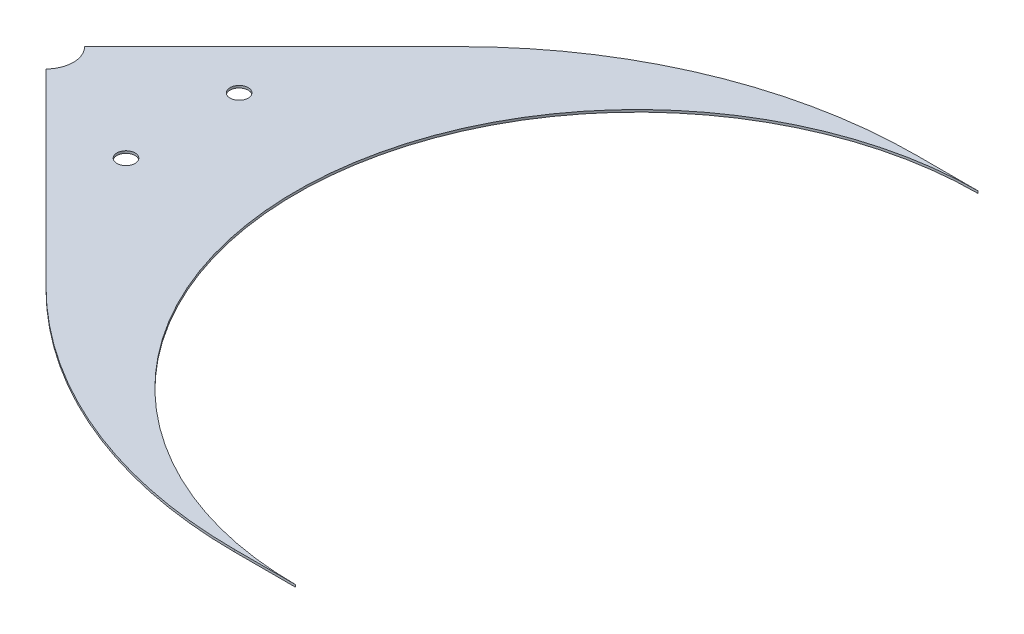
ISO-10303-21;
HEADER;
FILE_DESCRIPTION(('STEP AP214'),'2;1');
FILE_NAME('part.step','',(''),(''),'','','');
FILE_SCHEMA(('AUTOMOTIVE_DESIGN { 1 0 10303 214 1 1 1 1 }'));
ENDSEC;
DATA;
#1=APPLICATION_CONTEXT('core data for automotive mechanical design processes');
#2=APPLICATION_PROTOCOL_DEFINITION('international standard','automotive_design',2000,#1);
#3=PRODUCT_CONTEXT('',#1,'mechanical');
#4=PRODUCT('Part','Part','',(#3));
#5=PRODUCT_RELATED_PRODUCT_CATEGORY('part','',(#4));
#6=PRODUCT_DEFINITION_FORMATION('','',#4);
#7=PRODUCT_DEFINITION_CONTEXT('part definition',#1,'design');
#8=PRODUCT_DEFINITION('design','',#6,#7);
#9=PRODUCT_DEFINITION_SHAPE('','',#8);
#10=(LENGTH_UNIT() NAMED_UNIT(*) SI_UNIT(.MILLI.,.METRE.));
#11=(NAMED_UNIT(*) PLANE_ANGLE_UNIT() SI_UNIT($,.RADIAN.));
#12=(NAMED_UNIT(*) SI_UNIT($,.STERADIAN.) SOLID_ANGLE_UNIT());
#13=UNCERTAINTY_MEASURE_WITH_UNIT(LENGTH_MEASURE(1.E-05),#10,'distance_accuracy_value','');
#14=(GEOMETRIC_REPRESENTATION_CONTEXT(3) GLOBAL_UNCERTAINTY_ASSIGNED_CONTEXT((#13)) GLOBAL_UNIT_ASSIGNED_CONTEXT((#10,
#11,#12)) REPRESENTATION_CONTEXT('',''));
#15=CARTESIAN_POINT('',(0.,0.,0.));
#16=DIRECTION('',(0.,0.,1.));
#17=DIRECTION('',(1.,0.,0.));
#18=AXIS2_PLACEMENT_3D('',#15,#16,#17);
#19=CARTESIAN_POINT('',(149.999999999999,150.,150.));
#20=DIRECTION('',(0.,0.,1.));
#21=DIRECTION('',(1.,0.,0.));
#22=AXIS2_PLACEMENT_3D('',#19,#20,#21);
#23=PLANE('',#22);
#24=DIRECTION('',(0.,1.,0.));
#25=VECTOR('',#24,1.);
#26=CARTESIAN_POINT('',(232.842712474619,150.,150.));
#27=LINE('',#26,#25);
#28=CARTESIAN_POINT('',(232.842712474619,150.,150.));
#29=VERTEX_POINT('',#28);
#30=CARTESIAN_POINT('',(232.842712474619,151.,150.));
#31=VERTEX_POINT('',#30);
#32=EDGE_CURVE('E11',#29,#31,#27,.T.);
#33=ORIENTED_EDGE('',*,*,#32,.F.);
#34=DIRECTION('',(1.,0.,0.));
#35=VECTOR('',#34,1.);
#36=CARTESIAN_POINT('',(149.999999999999,150.,150.));
#37=LINE('',#36,#35);
#38=CARTESIAN_POINT('',(259.807621135335,150.,149.999938317262));
#39=VERTEX_POINT('',#38);
#40=EDGE_CURVE('E120',#29,#39,#37,.T.);
#41=ORIENTED_EDGE('',*,*,#40,.T.);
#42=CARTESIAN_POINT('',(259.807621135335,150.,150.));
#43=DIRECTION('',(0.,1.,0.));
#44=VECTOR('',#43,1.);
#45=LINE('',#42,#44);
#46=CARTESIAN_POINT('',(259.80762117489,151.,149.999938317313));
#47=VERTEX_POINT('',#46);
#48=EDGE_CURVE('E48',#39,#47,#45,.T.);
#49=ORIENTED_EDGE('',*,*,#48,.T.);
#50=DIRECTION('',(1.,0.,0.));
#51=VECTOR('',#50,1.);
#52=CARTESIAN_POINT('',(260.,151.,150.));
#53=LINE('',#52,#51);
#54=EDGE_CURVE('E381',#31,#47,#53,.T.);
#55=ORIENTED_EDGE('',*,*,#54,.F.);
#56=EDGE_LOOP('',(#33,#41,#49,#55));
#57=FACE_BOUND('',#56,.T.);
#58=ADVANCED_FACE('F38',(#57),#23,.T.);
#59=CARTESIAN_POINT('',(260.,150.,0.));
#60=DIRECTION('',(0.,1.,0.));
#61=DIRECTION('',(0.,0.,1.));
#62=AXIS2_PLACEMENT_3D('',#59,#60,#61);
#63=CYLINDRICAL_SURFACE('',#62,150.);
#64=ORIENTED_EDGE('',*,*,#48,.F.);
#65=CARTESIAN_POINT('',(260.,150.,0.));
#66=DIRECTION('',(0.,-1.,0.));
#67=DIRECTION('',(0.,0.,1.));
#68=AXIS2_PLACEMENT_3D('',#65,#66,#67);
#69=CIRCLE('',#68,150.);
#70=CARTESIAN_POINT('',(259.807621135335,150.,-149.999938317262));
#71=VERTEX_POINT('',#70);
#72=EDGE_CURVE('E103',#39,#71,#69,.T.);
#73=ORIENTED_EDGE('',*,*,#72,.T.);
#74=CARTESIAN_POINT('',(259.807621214445,150.,-149.999876634626));
#75=DIRECTION('',(0.,1.,0.));
#76=VECTOR('',#75,1.);
#77=LINE('',#74,#76);
#78=CARTESIAN_POINT('',(259.80762117489,151.,-149.999938317313));
#79=VERTEX_POINT('',#78);
#80=EDGE_CURVE('E111',#71,#79,#77,.T.);
#81=ORIENTED_EDGE('',*,*,#80,.T.);
#82=CARTESIAN_POINT('',(260.,151.,0.));
#83=DIRECTION('',(0.,-1.,0.));
#84=DIRECTION('',(0.,0.,-1.));
#85=AXIS2_PLACEMENT_3D('',#82,#83,#84);
#86=CIRCLE('',#85,150.);
#87=EDGE_CURVE('E105',#47,#79,#86,.T.);
#88=ORIENTED_EDGE('',*,*,#87,.F.);
#89=EDGE_LOOP('',(#64,#73,#81,#88));
#90=FACE_BOUND('',#89,.T.);
#91=ADVANCED_FACE('F102',(#90),#63,.F.);
#92=CARTESIAN_POINT('',(149.999999999999,150.,-150.));
#93=DIRECTION('',(0.,0.,-1.));
#94=DIRECTION('',(-1.,0.,0.));
#95=AXIS2_PLACEMENT_3D('',#92,#93,#94);
#96=PLANE('',#95);
#97=ORIENTED_EDGE('',*,*,#80,.F.);
#98=DIRECTION('',(-1.,0.,0.));
#99=VECTOR('',#98,1.);
#100=CARTESIAN_POINT('',(149.999999999999,150.,-150.));
#101=LINE('',#100,#99);
#102=CARTESIAN_POINT('',(232.842712474619,150.,-150.));
#103=VERTEX_POINT('',#102);
#104=EDGE_CURVE('E124',#71,#103,#101,.T.);
#105=ORIENTED_EDGE('',*,*,#104,.T.);
#106=DIRECTION('',(0.,1.,0.));
#107=VECTOR('',#106,1.);
#108=CARTESIAN_POINT('',(232.842712474619,150.,-150.));
#109=LINE('',#108,#107);
#110=CARTESIAN_POINT('',(232.842712474619,151.,-150.));
#111=VERTEX_POINT('',#110);
#112=EDGE_CURVE('E153',#103,#111,#109,.T.);
#113=ORIENTED_EDGE('',*,*,#112,.T.);
#114=DIRECTION('',(1.,0.,0.));
#115=VECTOR('',#114,1.);
#116=CARTESIAN_POINT('',(260.,151.,-150.));
#117=LINE('',#116,#115);
#118=EDGE_CURVE('E378',#79,#111,#117,.F.);
#119=ORIENTED_EDGE('',*,*,#118,.F.);
#120=EDGE_LOOP('',(#97,#105,#113,#119));
#121=FACE_BOUND('',#120,.T.);
#122=ADVANCED_FACE('F169',(#121),#96,.T.);
#123=CARTESIAN_POINT('',(232.842712474619,150.,50.));
#124=DIRECTION('',(0.,1.,0.));
#125=DIRECTION('',(0.,0.,1.));
#126=AXIS2_PLACEMENT_3D('',#123,#124,#125);
#127=CYLINDRICAL_SURFACE('',#126,200.);
#128=ORIENTED_EDGE('',*,*,#112,.F.);
#129=CARTESIAN_POINT('',(232.842712474619,150.,50.));
#130=DIRECTION('',(0.,1.,0.));
#131=DIRECTION('',(0.,0.,1.));
#132=AXIS2_PLACEMENT_3D('',#129,#130,#131);
#133=CIRCLE('',#132,200.);
#134=CARTESIAN_POINT('',(91.4213562373089,150.,-91.4213562373092));
#135=VERTEX_POINT('',#134);
#136=EDGE_CURVE('E137',#103,#135,#133,.T.);
#137=ORIENTED_EDGE('',*,*,#136,.T.);
#138=DIRECTION('',(0.,1.,0.));
#139=VECTOR('',#138,1.);
#140=CARTESIAN_POINT('',(91.4213562373089,150.,-91.4213562373092));
#141=LINE('',#140,#139);
#142=CARTESIAN_POINT('',(91.4213562373089,151.,-91.4213562373092));
#143=VERTEX_POINT('',#142);
#144=EDGE_CURVE('E151',#135,#143,#141,.T.);
#145=ORIENTED_EDGE('',*,*,#144,.T.);
#146=CARTESIAN_POINT('',(232.842712474619,151.,50.));
#147=DIRECTION('',(0.,1.,0.));
#148=DIRECTION('',(0.,0.,1.));
#149=AXIS2_PLACEMENT_3D('',#146,#147,#148);
#150=CIRCLE('',#149,200.);
#151=EDGE_CURVE('E375',#111,#143,#150,.T.);
#152=ORIENTED_EDGE('',*,*,#151,.F.);
#153=EDGE_LOOP('',(#128,#137,#145,#152));
#154=FACE_BOUND('',#153,.T.);
#155=ADVANCED_FACE('F208',(#154),#127,.T.);
#156=CARTESIAN_POINT('',(0.,150.,0.));
#157=DIRECTION('',(-0.707106781186549,0.,-0.707106781186546));
#158=DIRECTION('',(-0.707106781186546,0.,0.707106781186549));
#159=AXIS2_PLACEMENT_3D('',#156,#157,#158);
#160=PLANE('',#159);
#161=ORIENTED_EDGE('',*,*,#144,.F.);
#162=DIRECTION('',(-0.707106781186546,0.,0.707106781186549));
#163=VECTOR('',#162,1.);
#164=CARTESIAN_POINT('',(0.,150.,0.));
#165=LINE('',#164,#163);
#166=CARTESIAN_POINT('',(8.48528137423856,150.,-8.48528137423859));
#167=VERTEX_POINT('',#166);
#168=EDGE_CURVE('E142',#135,#167,#165,.T.);
#169=ORIENTED_EDGE('',*,*,#168,.T.);
#170=DIRECTION('',(0.,1.,0.));
#171=VECTOR('',#170,1.);
#172=CARTESIAN_POINT('',(8.48528137423856,150.,-8.48528137423859));
#173=LINE('',#172,#171);
#174=CARTESIAN_POINT('',(8.48528137423855,151.,-8.48528137423859));
#175=VERTEX_POINT('',#174);
#176=EDGE_CURVE('E149',#167,#175,#173,.T.);
#177=ORIENTED_EDGE('',*,*,#176,.T.);
#178=DIRECTION('',(-0.707106781186546,0.,0.707106781186549));
#179=VECTOR('',#178,1.);
#180=CARTESIAN_POINT('',(0.,151.,0.));
#181=LINE('',#180,#179);
#182=EDGE_CURVE('E372',#143,#175,#181,.T.);
#183=ORIENTED_EDGE('',*,*,#182,.F.);
#184=EDGE_LOOP('',(#161,#169,#177,#183));
#185=FACE_BOUND('',#184,.T.);
#186=ADVANCED_FACE('F215',(#185),#160,.T.);
#187=CARTESIAN_POINT('',(0.,150.,0.));
#188=DIRECTION('',(0.,1.,0.));
#189=DIRECTION('',(0.,0.,1.));
#190=AXIS2_PLACEMENT_3D('',#187,#188,#189);
#191=CYLINDRICAL_SURFACE('',#190,12.);
#192=ORIENTED_EDGE('',*,*,#176,.F.);
#193=CARTESIAN_POINT('',(0.,150.,0.));
#194=DIRECTION('',(0.,1.,0.));
#195=DIRECTION('',(0.,0.,1.));
#196=AXIS2_PLACEMENT_3D('',#193,#194,#195);
#197=CIRCLE('',#196,12.);
#198=CARTESIAN_POINT('',(8.48528137423856,150.,8.48528137423859));
#199=VERTEX_POINT('',#198);
#200=EDGE_CURVE('E145',#167,#199,#197,.F.);
#201=ORIENTED_EDGE('',*,*,#200,.T.);
#202=DIRECTION('',(0.,1.,0.));
#203=VECTOR('',#202,1.);
#204=CARTESIAN_POINT('',(8.48528137423856,150.,8.48528137423859));
#205=LINE('',#204,#203);
#206=CARTESIAN_POINT('',(8.48528137423855,151.,8.48528137423859));
#207=VERTEX_POINT('',#206);
#208=EDGE_CURVE('E56',#199,#207,#205,.T.);
#209=ORIENTED_EDGE('',*,*,#208,.T.);
#210=CARTESIAN_POINT('',(0.,151.,0.));
#211=DIRECTION('',(0.,1.,0.));
#212=DIRECTION('',(0.,0.,1.));
#213=AXIS2_PLACEMENT_3D('',#210,#211,#212);
#214=CIRCLE('',#213,12.);
#215=EDGE_CURVE('E369',#175,#207,#214,.F.);
#216=ORIENTED_EDGE('',*,*,#215,.F.);
#217=EDGE_LOOP('',(#192,#201,#209,#216));
#218=FACE_BOUND('',#217,.T.);
#219=ADVANCED_FACE('F222',(#218),#191,.F.);
#220=CARTESIAN_POINT('',(0.,150.,0.));
#221=DIRECTION('',(-0.707106781186549,0.,0.707106781186546));
#222=DIRECTION('',(0.707106781186546,0.,0.707106781186549));
#223=AXIS2_PLACEMENT_3D('',#220,#221,#222);
#224=PLANE('',#223);
#225=ORIENTED_EDGE('',*,*,#208,.F.);
#226=DIRECTION('',(0.707106781186546,0.,0.707106781186549));
#227=VECTOR('',#226,1.);
#228=CARTESIAN_POINT('',(0.,150.,0.));
#229=LINE('',#228,#227);
#230=CARTESIAN_POINT('',(91.4213562373089,150.,91.4213562373092));
#231=VERTEX_POINT('',#230);
#232=EDGE_CURVE('E128',#199,#231,#229,.T.);
#233=ORIENTED_EDGE('',*,*,#232,.T.);
#234=DIRECTION('',(0.,1.,0.));
#235=VECTOR('',#234,1.);
#236=CARTESIAN_POINT('',(91.4213562373089,150.,91.4213562373092));
#237=LINE('',#236,#235);
#238=CARTESIAN_POINT('',(91.4213562373089,151.,91.4213562373092));
#239=VERTEX_POINT('',#238);
#240=EDGE_CURVE('E42',#231,#239,#237,.T.);
#241=ORIENTED_EDGE('',*,*,#240,.T.);
#242=DIRECTION('',(0.707106781186546,0.,0.707106781186549));
#243=VECTOR('',#242,1.);
#244=CARTESIAN_POINT('',(0.,151.,0.));
#245=LINE('',#244,#243);
#246=EDGE_CURVE('E147',#207,#239,#245,.T.);
#247=ORIENTED_EDGE('',*,*,#246,.F.);
#248=EDGE_LOOP('',(#225,#233,#241,#247));
#249=FACE_BOUND('',#248,.T.);
#250=ADVANCED_FACE('F230',(#249),#224,.T.);
#251=CARTESIAN_POINT('',(232.842712474619,150.,-50.));
#252=DIRECTION('',(0.,1.,0.));
#253=DIRECTION('',(0.,0.,1.));
#254=AXIS2_PLACEMENT_3D('',#251,#252,#253);
#255=CYLINDRICAL_SURFACE('',#254,200.);
#256=CARTESIAN_POINT('',(232.842712474619,150.,-50.));
#257=DIRECTION('',(0.,1.,0.));
#258=DIRECTION('',(0.,0.,1.));
#259=AXIS2_PLACEMENT_3D('',#256,#257,#258);
#260=CIRCLE('',#259,200.);
#261=EDGE_CURVE('E126',#231,#29,#260,.T.);
#262=ORIENTED_EDGE('',*,*,#261,.T.);
#263=ORIENTED_EDGE('',*,*,#32,.T.);
#264=CARTESIAN_POINT('',(232.842712474619,151.,-50.));
#265=DIRECTION('',(0.,1.,0.));
#266=DIRECTION('',(0.,0.,1.));
#267=AXIS2_PLACEMENT_3D('',#264,#265,#266);
#268=CIRCLE('',#267,200.);
#269=EDGE_CURVE('E368',#239,#31,#268,.T.);
#270=ORIENTED_EDGE('',*,*,#269,.F.);
#271=ORIENTED_EDGE('',*,*,#240,.F.);
#272=EDGE_LOOP('',(#262,#263,#270,#271));
#273=FACE_BOUND('',#272,.T.);
#274=ADVANCED_FACE('F40',(#273),#255,.T.);
#275=CARTESIAN_POINT('',(260.,151.,0.));
#276=DIRECTION('',(0.,1.,0.));
#277=DIRECTION('',(0.,0.,1.));
#278=AXIS2_PLACEMENT_3D('',#275,#276,#277);
#279=PLANE('',#278);
#280=CARTESIAN_POINT('',(60.0521696132336,151.,-24.8744231037309));
#281=DIRECTION('',(0.,1.,0.));
#282=DIRECTION('',(0.,0.,1.));
#283=AXIS2_PLACEMENT_3D('',#280,#281,#282);
#284=CIRCLE('',#283,4.);
#285=CARTESIAN_POINT('',(60.0521696132336,151.,-20.8744231037309));
#286=VERTEX_POINT('',#285);
#287=EDGE_CURVE('E352',#286,#286,#284,.T.);
#288=ORIENTED_EDGE('',*,*,#287,.F.);
#289=EDGE_LOOP('',(#288));
#290=FACE_BOUND('',#289,.T.);
#291=CARTESIAN_POINT('',(60.0521696132336,151.,24.8744231037309));
#292=DIRECTION('',(0.,1.,0.));
#293=DIRECTION('',(0.,0.,-1.));
#294=AXIS2_PLACEMENT_3D('',#291,#292,#293);
#295=CIRCLE('',#294,4.);
#296=CARTESIAN_POINT('',(60.0521696132336,151.,20.8744231037309));
#297=VERTEX_POINT('',#296);
#298=EDGE_CURVE('E361',#297,#297,#295,.T.);
#299=ORIENTED_EDGE('',*,*,#298,.F.);
#300=EDGE_LOOP('',(#299));
#301=FACE_BOUND('',#300,.T.);
#302=ORIENTED_EDGE('',*,*,#246,.T.);
#303=ORIENTED_EDGE('',*,*,#269,.T.);
#304=ORIENTED_EDGE('',*,*,#54,.T.);
#305=ORIENTED_EDGE('',*,*,#87,.T.);
#306=ORIENTED_EDGE('',*,*,#118,.T.);
#307=ORIENTED_EDGE('',*,*,#151,.T.);
#308=ORIENTED_EDGE('',*,*,#182,.T.);
#309=ORIENTED_EDGE('',*,*,#215,.T.);
#310=EDGE_LOOP('',(#302,#303,#304,#305,#306,#307,#308,#309));
#311=FACE_BOUND('',#310,.T.);
#312=ADVANCED_FACE('F244',(#290,#301,#311),#279,.T.);
#313=CARTESIAN_POINT('',(260.,150.,0.));
#314=DIRECTION('',(0.,1.,0.));
#315=DIRECTION('',(0.,0.,1.));
#316=AXIS2_PLACEMENT_3D('',#313,#314,#315);
#317=PLANE('',#316);
#318=CARTESIAN_POINT('',(60.0521696132336,150.,-24.8744231037309));
#319=DIRECTION('',(0.,1.,0.));
#320=DIRECTION('',(0.,0.,1.));
#321=AXIS2_PLACEMENT_3D('',#318,#319,#320);
#322=CIRCLE('',#321,4.);
#323=CARTESIAN_POINT('',(60.0521696132336,150.,-20.8744231037309));
#324=VERTEX_POINT('',#323);
#325=EDGE_CURVE('E355',#324,#324,#322,.F.);
#326=ORIENTED_EDGE('',*,*,#325,.F.);
#327=EDGE_LOOP('',(#326));
#328=FACE_BOUND('',#327,.T.);
#329=CARTESIAN_POINT('',(60.0521696132336,150.,24.8744231037309));
#330=DIRECTION('',(0.,1.,0.));
#331=DIRECTION('',(0.,0.,1.));
#332=AXIS2_PLACEMENT_3D('',#329,#330,#331);
#333=CIRCLE('',#332,4.);
#334=CARTESIAN_POINT('',(60.0521696132336,150.,28.8744231037309));
#335=VERTEX_POINT('',#334);
#336=EDGE_CURVE('E358',#335,#335,#333,.F.);
#337=ORIENTED_EDGE('',*,*,#336,.F.);
#338=EDGE_LOOP('',(#337));
#339=FACE_BOUND('',#338,.T.);
#340=ORIENTED_EDGE('',*,*,#232,.F.);
#341=ORIENTED_EDGE('',*,*,#200,.F.);
#342=ORIENTED_EDGE('',*,*,#168,.F.);
#343=ORIENTED_EDGE('',*,*,#136,.F.);
#344=ORIENTED_EDGE('',*,*,#104,.F.);
#345=ORIENTED_EDGE('',*,*,#72,.F.);
#346=ORIENTED_EDGE('',*,*,#40,.F.);
#347=ORIENTED_EDGE('',*,*,#261,.F.);
#348=EDGE_LOOP('',(#340,#341,#342,#343,#344,#345,#346,#347));
#349=FACE_BOUND('',#348,.T.);
#350=ADVANCED_FACE('F118',(#328,#339,#349),#317,.F.);
#351=CARTESIAN_POINT('',(60.0521696132336,149.99814158631,24.8744231037309));
#352=DIRECTION('',(0.,1.,0.));
#353=DIRECTION('',(0.,0.,1.));
#354=AXIS2_PLACEMENT_3D('',#351,#352,#353);
#355=CYLINDRICAL_SURFACE('',#354,4.);
#356=ORIENTED_EDGE('',*,*,#298,.T.);
#357=EDGE_LOOP('',(#356));
#358=FACE_BOUND('',#357,.T.);
#359=ORIENTED_EDGE('',*,*,#336,.T.);
#360=EDGE_LOOP('',(#359));
#361=FACE_BOUND('',#360,.T.);
#362=ADVANCED_FACE('F258',(#358,#361),#355,.F.);
#363=CARTESIAN_POINT('',(60.0521696132336,149.99814158631,-24.8744231037309));
#364=DIRECTION('',(0.,1.,0.));
#365=DIRECTION('',(0.,0.,1.));
#366=AXIS2_PLACEMENT_3D('',#363,#364,#365);
#367=CYLINDRICAL_SURFACE('',#366,4.);
#368=ORIENTED_EDGE('',*,*,#287,.T.);
#369=EDGE_LOOP('',(#368));
#370=FACE_BOUND('',#369,.T.);
#371=ORIENTED_EDGE('',*,*,#325,.T.);
#372=EDGE_LOOP('',(#371));
#373=FACE_BOUND('',#372,.T.);
#374=ADVANCED_FACE('F266',(#370,#373),#367,.F.);
#375=CLOSED_SHELL('',(#58,#91,#122,#155,#186,#219,#250,#274,#312,#350,#362,#374));
#376=MANIFOLD_SOLID_BREP('B2',#375);
#377=ADVANCED_BREP_SHAPE_REPRESENTATION('',(#18,#376),#14);
#378=SHAPE_DEFINITION_REPRESENTATION(#9,#377);
ENDSEC;
END-ISO-10303-21;
